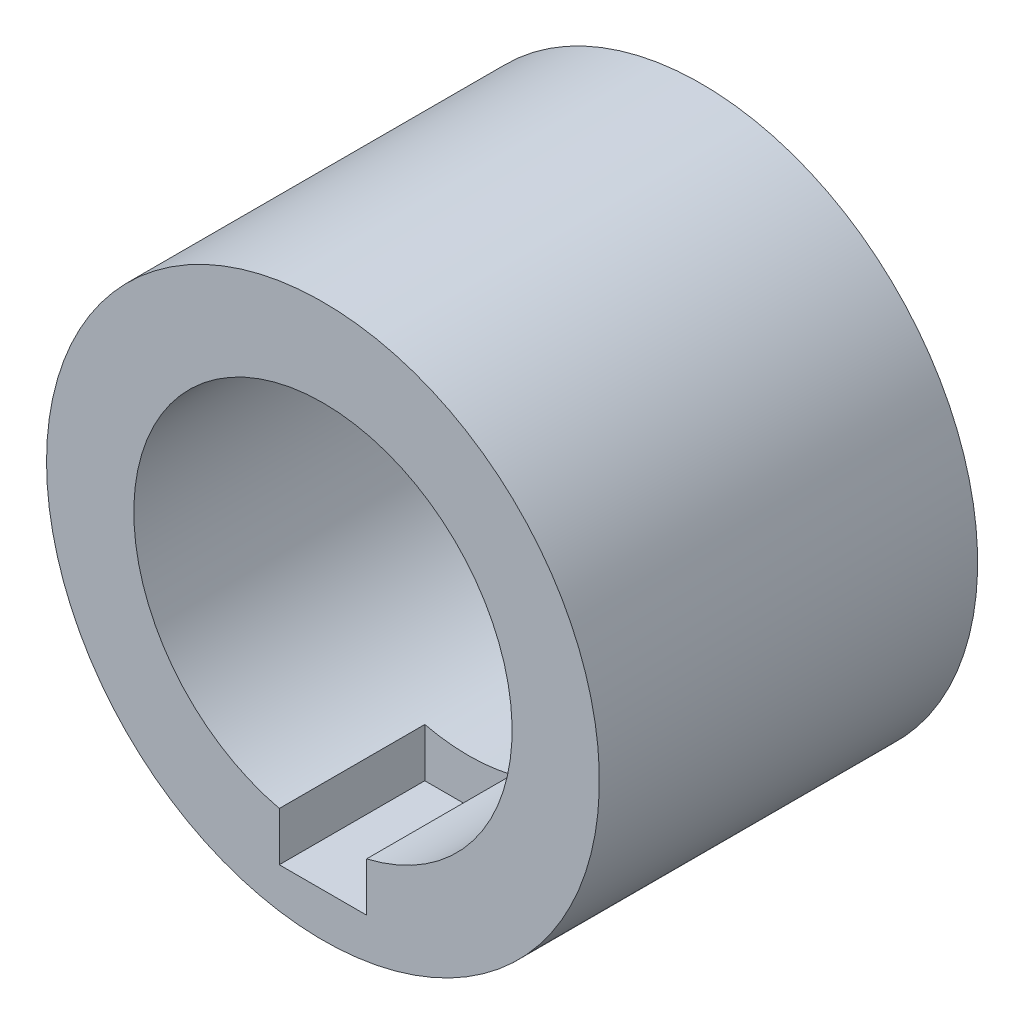
ISO-10303-21;
HEADER;
FILE_DESCRIPTION(('STEP AP214'),'2;1');
FILE_NAME('part.step','',(''),(''),'','','');
FILE_SCHEMA(('AUTOMOTIVE_DESIGN { 1 0 10303 214 1 1 1 1 }'));
ENDSEC;
DATA;
#1=APPLICATION_CONTEXT('core data for automotive mechanical design processes');
#2=APPLICATION_PROTOCOL_DEFINITION('international standard','automotive_design',2000,#1);
#3=PRODUCT_CONTEXT('',#1,'mechanical');
#4=PRODUCT('Part','Part','',(#3));
#5=PRODUCT_RELATED_PRODUCT_CATEGORY('part','',(#4));
#6=PRODUCT_DEFINITION_FORMATION('','',#4);
#7=PRODUCT_DEFINITION_CONTEXT('part definition',#1,'design');
#8=PRODUCT_DEFINITION('design','',#6,#7);
#9=PRODUCT_DEFINITION_SHAPE('','',#8);
#10=(LENGTH_UNIT() NAMED_UNIT(*) SI_UNIT(.MILLI.,.METRE.));
#11=(NAMED_UNIT(*) PLANE_ANGLE_UNIT() SI_UNIT($,.RADIAN.));
#12=(NAMED_UNIT(*) SI_UNIT($,.STERADIAN.) SOLID_ANGLE_UNIT());
#13=UNCERTAINTY_MEASURE_WITH_UNIT(LENGTH_MEASURE(1.E-05),#10,'distance_accuracy_value','');
#14=(GEOMETRIC_REPRESENTATION_CONTEXT(3) GLOBAL_UNCERTAINTY_ASSIGNED_CONTEXT((#13)) GLOBAL_UNIT_ASSIGNED_CONTEXT((#10,
#11,#12)) REPRESENTATION_CONTEXT('',''));
#15=CARTESIAN_POINT('',(0.,0.,0.));
#16=DIRECTION('',(0.,0.,1.));
#17=DIRECTION('',(1.,0.,0.));
#18=AXIS2_PLACEMENT_3D('',#15,#16,#17);
#19=CARTESIAN_POINT('',(0.,0.,6.5));
#20=DIRECTION('',(0.,0.,-1.));
#21=DIRECTION('',(-1.,0.,0.));
#22=AXIS2_PLACEMENT_3D('',#19,#20,#21);
#23=CYLINDRICAL_SURFACE('',#22,6.5);
#24=CARTESIAN_POINT('',(0.,0.,-6.5));
#25=DIRECTION('',(0.,0.,1.));
#26=DIRECTION('',(1.,0.,0.));
#27=AXIS2_PLACEMENT_3D('',#24,#25,#26);
#28=CIRCLE('',#27,6.5);
#29=CARTESIAN_POINT('',(6.5,0.,-6.5));
#30=VERTEX_POINT('',#29);
#31=EDGE_CURVE('E98',#30,#30,#28,.T.);
#32=ORIENTED_EDGE('',*,*,#31,.F.);
#33=EDGE_LOOP('',(#32));
#34=FACE_BOUND('',#33,.T.);
#35=CARTESIAN_POINT('',(0.,0.,1.5));
#36=DIRECTION('',(0.,0.,1.));
#37=DIRECTION('',(1.,0.,0.));
#38=AXIS2_PLACEMENT_3D('',#35,#36,#37);
#39=CIRCLE('',#38,6.5);
#40=CARTESIAN_POINT('',(1.5,-6.32455532033676,1.5));
#41=VERTEX_POINT('',#40);
#42=CARTESIAN_POINT('',(-1.5,-6.32455532033676,1.5));
#43=VERTEX_POINT('',#42);
#44=EDGE_CURVE('E83',#41,#43,#39,.F.);
#45=ORIENTED_EDGE('',*,*,#44,.F.);
#46=DIRECTION('',(0.,0.,-1.));
#47=VECTOR('',#46,1.);
#48=CARTESIAN_POINT('',(1.5,-6.32455532033676,6.5));
#49=LINE('',#48,#47);
#50=CARTESIAN_POINT('',(1.5,-6.32455532033676,6.5));
#51=VERTEX_POINT('',#50);
#52=EDGE_CURVE('E89',#51,#41,#49,.T.);
#53=ORIENTED_EDGE('',*,*,#52,.F.);
#54=CARTESIAN_POINT('',(0.,0.,6.5));
#55=DIRECTION('',(0.,0.,1.));
#56=DIRECTION('',(1.,0.,0.));
#57=AXIS2_PLACEMENT_3D('',#54,#55,#56);
#58=CIRCLE('',#57,6.5);
#59=CARTESIAN_POINT('',(-1.5,-6.32455532033676,6.5));
#60=VERTEX_POINT('',#59);
#61=EDGE_CURVE('E43',#51,#60,#58,.T.);
#62=ORIENTED_EDGE('',*,*,#61,.T.);
#63=DIRECTION('',(0.,0.,-1.));
#64=VECTOR('',#63,1.);
#65=CARTESIAN_POINT('',(-1.5,-6.32455532033676,6.5));
#66=LINE('',#65,#64);
#67=EDGE_CURVE('E96',#43,#60,#66,.F.);
#68=ORIENTED_EDGE('',*,*,#67,.F.);
#69=EDGE_LOOP('',(#45,#53,#62,#68));
#70=FACE_BOUND('',#69,.T.);
#71=ADVANCED_FACE('F35',(#34,#70),#23,.F.);
#72=CARTESIAN_POINT('',(0.,0.,6.5));
#73=DIRECTION('',(0.,0.,1.));
#74=DIRECTION('',(1.,0.,0.));
#75=AXIS2_PLACEMENT_3D('',#72,#73,#74);
#76=PLANE('',#75);
#77=CARTESIAN_POINT('',(0.,0.,6.5));
#78=DIRECTION('',(0.,0.,1.));
#79=DIRECTION('',(1.,0.,0.));
#80=AXIS2_PLACEMENT_3D('',#77,#78,#79);
#81=CIRCLE('',#80,9.5);
#82=CARTESIAN_POINT('',(-9.5,0.,6.5));
#83=VERTEX_POINT('',#82);
#84=EDGE_CURVE('E11',#83,#83,#81,.T.);
#85=ORIENTED_EDGE('',*,*,#84,.T.);
#86=EDGE_LOOP('',(#85));
#87=FACE_BOUND('',#86,.T.);
#88=ORIENTED_EDGE('',*,*,#61,.F.);
#89=DIRECTION('',(0.,-1.,0.));
#90=VECTOR('',#89,1.);
#91=CARTESIAN_POINT('',(1.5,9.501,6.5));
#92=LINE('',#91,#90);
#93=CARTESIAN_POINT('',(1.5,-8.,6.5));
#94=VERTEX_POINT('',#93);
#95=EDGE_CURVE('E59',#51,#94,#92,.T.);
#96=ORIENTED_EDGE('',*,*,#95,.T.);
#97=DIRECTION('',(1.,0.,0.));
#98=VECTOR('',#97,1.);
#99=CARTESIAN_POINT('',(-1.5,-8.,6.5));
#100=LINE('',#99,#98);
#101=CARTESIAN_POINT('',(-1.5,-8.,6.5));
#102=VERTEX_POINT('',#101);
#103=EDGE_CURVE('E94',#102,#94,#100,.T.);
#104=ORIENTED_EDGE('',*,*,#103,.F.);
#105=DIRECTION('',(0.,-1.,0.));
#106=VECTOR('',#105,1.);
#107=CARTESIAN_POINT('',(-1.5,9.501,6.5));
#108=LINE('',#107,#106);
#109=EDGE_CURVE('E148',#60,#102,#108,.T.);
#110=ORIENTED_EDGE('',*,*,#109,.F.);
#111=EDGE_LOOP('',(#88,#96,#104,#110));
#112=FACE_BOUND('',#111,.T.);
#113=ADVANCED_FACE('F119',(#87,#112),#76,.T.);
#114=CARTESIAN_POINT('',(0.,0.,6.5));
#115=DIRECTION('',(0.,0.,-1.));
#116=DIRECTION('',(-1.,0.,0.));
#117=AXIS2_PLACEMENT_3D('',#114,#115,#116);
#118=CYLINDRICAL_SURFACE('',#117,9.5);
#119=CARTESIAN_POINT('',(0.,0.,-6.5));
#120=DIRECTION('',(0.,0.,1.));
#121=DIRECTION('',(1.,0.,0.));
#122=AXIS2_PLACEMENT_3D('',#119,#120,#121);
#123=CIRCLE('',#122,9.5);
#124=CARTESIAN_POINT('',(-9.5,0.,-6.5));
#125=VERTEX_POINT('',#124);
#126=EDGE_CURVE('E38',#125,#125,#123,.T.);
#127=CARTESIAN_POINT('',(-9.5,0.,6.5));
#128=CARTESIAN_POINT('',(-9.5,0.,6.36458333333333));
#129=CARTESIAN_POINT('',(-9.5,0.,6.22916666666667));
#130=CARTESIAN_POINT('',(-9.5,0.,5.95833333333333));
#131=CARTESIAN_POINT('',(-9.5,0.,5.82291666666667));
#132=CARTESIAN_POINT('',(-9.5,0.,5.55208333333333));
#133=CARTESIAN_POINT('',(-9.5,0.,5.41666666666667));
#134=CARTESIAN_POINT('',(-9.5,0.,5.14583333333333));
#135=CARTESIAN_POINT('',(-9.5,0.,5.01041666666667));
#136=CARTESIAN_POINT('',(-9.5,0.,4.73958333333333));
#137=CARTESIAN_POINT('',(-9.5,0.,4.60416666666667));
#138=CARTESIAN_POINT('',(-9.5,0.,4.33333333333333));
#139=CARTESIAN_POINT('',(-9.5,0.,4.19791666666667));
#140=CARTESIAN_POINT('',(-9.5,0.,3.92708333333333));
#141=CARTESIAN_POINT('',(-9.5,0.,3.79166666666667));
#142=CARTESIAN_POINT('',(-9.5,0.,3.52083333333333));
#143=CARTESIAN_POINT('',(-9.5,0.,3.38541666666667));
#144=CARTESIAN_POINT('',(-9.5,0.,3.11458333333333));
#145=CARTESIAN_POINT('',(-9.5,0.,2.97916666666667));
#146=CARTESIAN_POINT('',(-9.5,0.,2.70833333333333));
#147=CARTESIAN_POINT('',(-9.5,0.,2.57291666666667));
#148=CARTESIAN_POINT('',(-9.5,0.,2.30208333333333));
#149=CARTESIAN_POINT('',(-9.5,0.,2.16666666666667));
#150=CARTESIAN_POINT('',(-9.5,0.,1.89583333333333));
#151=CARTESIAN_POINT('',(-9.5,0.,1.76041666666667));
#152=CARTESIAN_POINT('',(-9.5,0.,1.48958333333333));
#153=CARTESIAN_POINT('',(-9.5,0.,1.35416666666667));
#154=CARTESIAN_POINT('',(-9.5,0.,1.08333333333333));
#155=CARTESIAN_POINT('',(-9.5,0.,0.947916666666666));
#156=CARTESIAN_POINT('',(-9.5,0.,0.677083333333332));
#157=CARTESIAN_POINT('',(-9.5,0.,0.541666666666666));
#158=CARTESIAN_POINT('',(-9.5,0.,0.270833333333333));
#159=CARTESIAN_POINT('',(-9.5,0.,0.135416666666666));
#160=CARTESIAN_POINT('',(-9.5,0.,-0.135416666666668));
#161=CARTESIAN_POINT('',(-9.5,0.,-0.270833333333334));
#162=CARTESIAN_POINT('',(-9.5,0.,-0.541666666666668));
#163=CARTESIAN_POINT('',(-9.5,0.,-0.677083333333334));
#164=CARTESIAN_POINT('',(-9.5,0.,-0.947916666666667));
#165=CARTESIAN_POINT('',(-9.5,0.,-1.08333333333333));
#166=CARTESIAN_POINT('',(-9.5,0.,-1.35416666666667));
#167=CARTESIAN_POINT('',(-9.5,0.,-1.48958333333333));
#168=CARTESIAN_POINT('',(-9.5,0.,-1.76041666666667));
#169=CARTESIAN_POINT('',(-9.5,0.,-1.89583333333333));
#170=CARTESIAN_POINT('',(-9.5,0.,-2.16666666666667));
#171=CARTESIAN_POINT('',(-9.5,0.,-2.30208333333333));
#172=CARTESIAN_POINT('',(-9.5,0.,-2.57291666666667));
#173=CARTESIAN_POINT('',(-9.5,0.,-2.70833333333333));
#174=CARTESIAN_POINT('',(-9.5,0.,-2.97916666666667));
#175=CARTESIAN_POINT('',(-9.5,0.,-3.11458333333333));
#176=CARTESIAN_POINT('',(-9.5,0.,-3.38541666666667));
#177=CARTESIAN_POINT('',(-9.5,0.,-3.52083333333333));
#178=CARTESIAN_POINT('',(-9.5,0.,-3.79166666666667));
#179=CARTESIAN_POINT('',(-9.5,0.,-3.92708333333333));
#180=CARTESIAN_POINT('',(-9.5,0.,-4.19791666666667));
#181=CARTESIAN_POINT('',(-9.5,0.,-4.33333333333333));
#182=CARTESIAN_POINT('',(-9.5,0.,-4.60416666666667));
#183=CARTESIAN_POINT('',(-9.5,0.,-4.73958333333333));
#184=CARTESIAN_POINT('',(-9.5,0.,-5.01041666666667));
#185=CARTESIAN_POINT('',(-9.5,0.,-5.14583333333333));
#186=CARTESIAN_POINT('',(-9.5,0.,-5.41666666666667));
#187=CARTESIAN_POINT('',(-9.5,0.,-5.55208333333333));
#188=CARTESIAN_POINT('',(-9.5,0.,-5.82291666666667));
#189=CARTESIAN_POINT('',(-9.5,0.,-5.95833333333333));
#190=CARTESIAN_POINT('',(-9.5,0.,-6.22916666666667));
#191=CARTESIAN_POINT('',(-9.5,0.,-6.36458333333333));
#192=CARTESIAN_POINT('',(-9.5,0.,-6.5));
#193=B_SPLINE_CURVE_WITH_KNOTS('',3,(#127,#128,#129,#130,#131,#132,#133,#134,#135,#136,#137,
#138,#139,#140,#141,#142,#143,#144,#145,#146,#147,#148,#149,#150,#151,#152,#153,#154,#155,#156,
#157,#158,#159,#160,#161,#162,#163,#164,#165,#166,#167,#168,#169,#170,#171,#172,#173,#174,#175,
#176,#177,#178,#179,#180,#181,#182,#183,#184,#185,#186,#187,#188,#189,#190,#191,#192),
.UNSPECIFIED.,.F.,.F.,(4,2,2,2,2,2,2,2,2,2,2,2,2,2,2,2,2,2,2,2,2,2,2,2,2,2,2,2,2,2,2,2,4),(0.,
0.40625,0.8125,1.21875,1.625,2.03125,2.4375,2.84375,3.25,3.65625,4.0625,4.46875,4.875,5.28125,
5.6875,6.09375,6.5,6.90625,7.3125,7.71875,8.125,8.53125,8.9375,9.34375,9.75,10.15625,10.5625,
10.96875,11.375,11.78125,12.1875,12.59375,13.),.UNSPECIFIED.);
#194=EDGE_CURVE('BSEAM109',#83,#125,#193,.T.);
#195=ORIENTED_EDGE('',*,*,#84,.F.);
#196=ORIENTED_EDGE('',*,*,#126,.T.);
#197=ORIENTED_EDGE('',*,*,#194,.T.);
#198=ORIENTED_EDGE('',*,*,#194,.F.);
#199=EDGE_LOOP('',(#195,#197,#196,#198));
#200=FACE_BOUND('',#199,.T.);
#201=ADVANCED_FACE('F109',(#200),#118,.T.);
#202=CARTESIAN_POINT('',(0.,0.,-6.5));
#203=DIRECTION('',(0.,0.,1.));
#204=DIRECTION('',(1.,0.,0.));
#205=AXIS2_PLACEMENT_3D('',#202,#203,#204);
#206=PLANE('',#205);
#207=ORIENTED_EDGE('',*,*,#31,.T.);
#208=EDGE_LOOP('',(#207));
#209=FACE_BOUND('',#208,.T.);
#210=ORIENTED_EDGE('',*,*,#126,.F.);
#211=EDGE_LOOP('',(#210));
#212=FACE_BOUND('',#211,.T.);
#213=ADVANCED_FACE('F111',(#209,#212),#206,.F.);
#214=CARTESIAN_POINT('',(1.5,9.501,1.5));
#215=DIRECTION('',(-1.,0.,0.));
#216=DIRECTION('',(0.,0.,1.));
#217=AXIS2_PLACEMENT_3D('',#214,#215,#216);
#218=PLANE('',#217);
#219=ORIENTED_EDGE('',*,*,#52,.T.);
#220=DIRECTION('',(0.,-1.,0.));
#221=VECTOR('',#220,1.);
#222=CARTESIAN_POINT('',(1.5,9.501,1.5));
#223=LINE('',#222,#221);
#224=CARTESIAN_POINT('',(1.5,-8.,1.5));
#225=VERTEX_POINT('',#224);
#226=EDGE_CURVE('E80',#41,#225,#223,.T.);
#227=ORIENTED_EDGE('',*,*,#226,.T.);
#228=DIRECTION('',(0.,0.,-1.));
#229=VECTOR('',#228,1.);
#230=CARTESIAN_POINT('',(1.5,-8.,1.5));
#231=LINE('',#230,#229);
#232=EDGE_CURVE('E87',#94,#225,#231,.T.);
#233=ORIENTED_EDGE('',*,*,#232,.F.);
#234=ORIENTED_EDGE('',*,*,#95,.F.);
#235=EDGE_LOOP('',(#219,#227,#233,#234));
#236=FACE_BOUND('',#235,.T.);
#237=ADVANCED_FACE('F90',(#236),#218,.T.);
#238=CARTESIAN_POINT('',(-1.5,9.501,1.5));
#239=DIRECTION('',(0.,0.,1.));
#240=DIRECTION('',(1.,0.,0.));
#241=AXIS2_PLACEMENT_3D('',#238,#239,#240);
#242=PLANE('',#241);
#243=ORIENTED_EDGE('',*,*,#44,.T.);
#244=DIRECTION('',(0.,-1.,0.));
#245=VECTOR('',#244,1.);
#246=CARTESIAN_POINT('',(-1.5,9.501,1.5));
#247=LINE('',#246,#245);
#248=CARTESIAN_POINT('',(-1.5,-8.,1.5));
#249=VERTEX_POINT('',#248);
#250=EDGE_CURVE('E147',#43,#249,#247,.T.);
#251=ORIENTED_EDGE('',*,*,#250,.T.);
#252=DIRECTION('',(-1.,0.,0.));
#253=VECTOR('',#252,1.);
#254=CARTESIAN_POINT('',(-1.5,-8.,1.5));
#255=LINE('',#254,#253);
#256=EDGE_CURVE('E85',#225,#249,#255,.T.);
#257=ORIENTED_EDGE('',*,*,#256,.F.);
#258=ORIENTED_EDGE('',*,*,#226,.F.);
#259=EDGE_LOOP('',(#243,#251,#257,#258));
#260=FACE_BOUND('',#259,.T.);
#261=ADVANCED_FACE('F81',(#260),#242,.T.);
#262=CARTESIAN_POINT('',(-1.5,9.501,1.5));
#263=DIRECTION('',(1.,0.,0.));
#264=DIRECTION('',(0.,0.,-1.));
#265=AXIS2_PLACEMENT_3D('',#262,#263,#264);
#266=PLANE('',#265);
#267=ORIENTED_EDGE('',*,*,#67,.T.);
#268=ORIENTED_EDGE('',*,*,#109,.T.);
#269=DIRECTION('',(0.,0.,1.));
#270=VECTOR('',#269,1.);
#271=CARTESIAN_POINT('',(-1.5,-8.,1.5));
#272=LINE('',#271,#270);
#273=EDGE_CURVE('E51',#249,#102,#272,.T.);
#274=ORIENTED_EDGE('',*,*,#273,.F.);
#275=ORIENTED_EDGE('',*,*,#250,.F.);
#276=EDGE_LOOP('',(#267,#268,#274,#275));
#277=FACE_BOUND('',#276,.T.);
#278=ADVANCED_FACE('F134',(#277),#266,.T.);
#279=CARTESIAN_POINT('',(0.,-8.,0.));
#280=DIRECTION('',(0.,1.,0.));
#281=DIRECTION('',(0.,0.,1.));
#282=AXIS2_PLACEMENT_3D('',#279,#280,#281);
#283=PLANE('',#282);
#284=ORIENTED_EDGE('',*,*,#232,.T.);
#285=ORIENTED_EDGE('',*,*,#256,.T.);
#286=ORIENTED_EDGE('',*,*,#273,.T.);
#287=ORIENTED_EDGE('',*,*,#103,.T.);
#288=EDGE_LOOP('',(#284,#285,#286,#287));
#289=FACE_BOUND('',#288,.T.);
#290=ADVANCED_FACE('F137',(#289),#283,.T.);
#291=CLOSED_SHELL('',(#71,#113,#201,#213,#237,#261,#278,#290));
#292=MANIFOLD_SOLID_BREP('B2',#291);
#293=ADVANCED_BREP_SHAPE_REPRESENTATION('',(#18,#292),#14);
#294=SHAPE_DEFINITION_REPRESENTATION(#9,#293);
ENDSEC;
END-ISO-10303-21;
